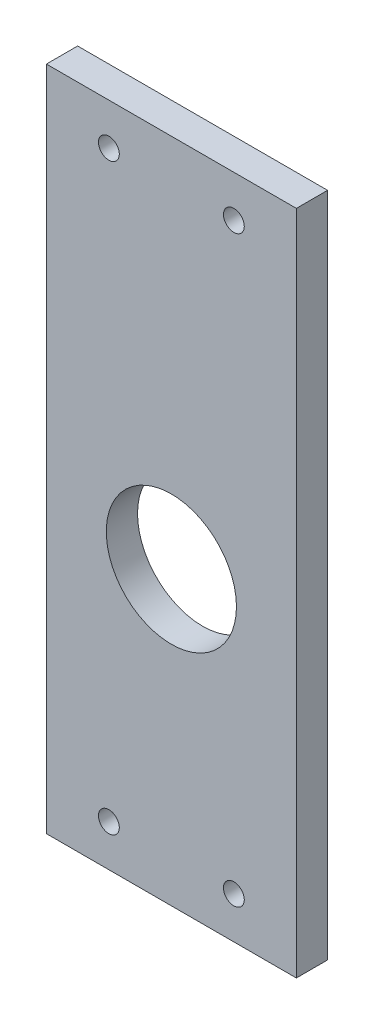
ISO-10303-21;
HEADER;
FILE_DESCRIPTION(('STEP AP214'),'2;1');
FILE_NAME('part.step','',(''),(''),'','','');
FILE_SCHEMA(('AUTOMOTIVE_DESIGN { 1 0 10303 214 1 1 1 1 }'));
ENDSEC;
DATA;
#1=APPLICATION_CONTEXT('core data for automotive mechanical design processes');
#2=APPLICATION_PROTOCOL_DEFINITION('international standard','automotive_design',2000,#1);
#3=PRODUCT_CONTEXT('',#1,'mechanical');
#4=PRODUCT('Part','Part','',(#3));
#5=PRODUCT_RELATED_PRODUCT_CATEGORY('part','',(#4));
#6=PRODUCT_DEFINITION_FORMATION('','',#4);
#7=PRODUCT_DEFINITION_CONTEXT('part definition',#1,'design');
#8=PRODUCT_DEFINITION('design','',#6,#7);
#9=PRODUCT_DEFINITION_SHAPE('','',#8);
#10=(LENGTH_UNIT() NAMED_UNIT(*) SI_UNIT(.MILLI.,.METRE.));
#11=(NAMED_UNIT(*) PLANE_ANGLE_UNIT() SI_UNIT($,.RADIAN.));
#12=(NAMED_UNIT(*) SI_UNIT($,.STERADIAN.) SOLID_ANGLE_UNIT());
#13=UNCERTAINTY_MEASURE_WITH_UNIT(LENGTH_MEASURE(1.E-05),#10,'distance_accuracy_value','');
#14=(GEOMETRIC_REPRESENTATION_CONTEXT(3) GLOBAL_UNCERTAINTY_ASSIGNED_CONTEXT((#13)) GLOBAL_UNIT_ASSIGNED_CONTEXT((#10,
#11,#12)) REPRESENTATION_CONTEXT('',''));
#15=CARTESIAN_POINT('',(0.,0.,0.));
#16=DIRECTION('',(0.,0.,1.));
#17=DIRECTION('',(1.,0.,0.));
#18=AXIS2_PLACEMENT_3D('',#15,#16,#17);
#19=CARTESIAN_POINT('',(0.,0.,9.525));
#20=DIRECTION('',(1.,0.,0.));
#21=DIRECTION('',(0.,0.,-1.));
#22=AXIS2_PLACEMENT_3D('',#19,#20,#21);
#23=PLANE('',#22);
#24=DIRECTION('',(0.,-1.,0.));
#25=VECTOR('',#24,1.);
#26=CARTESIAN_POINT('',(0.,0.,0.));
#27=LINE('',#26,#25);
#28=CARTESIAN_POINT('',(0.,203.2,0.));
#29=VERTEX_POINT('',#28);
#30=CARTESIAN_POINT('',(0.,0.,0.));
#31=VERTEX_POINT('',#30);
#32=EDGE_CURVE('E95',#29,#31,#27,.T.);
#33=ORIENTED_EDGE('',*,*,#32,.T.);
#34=DIRECTION('',(0.,0.,-1.));
#35=VECTOR('',#34,1.);
#36=CARTESIAN_POINT('',(0.,0.,9.525));
#37=LINE('',#36,#35);
#38=CARTESIAN_POINT('',(0.,0.,9.525));
#39=VERTEX_POINT('',#38);
#40=EDGE_CURVE('E11',#39,#31,#37,.T.);
#41=ORIENTED_EDGE('',*,*,#40,.F.);
#42=DIRECTION('',(0.,-1.,0.));
#43=VECTOR('',#42,1.);
#44=CARTESIAN_POINT('',(0.,0.,9.525));
#45=LINE('',#44,#43);
#46=CARTESIAN_POINT('',(0.,203.2,9.525));
#47=VERTEX_POINT('',#46);
#48=EDGE_CURVE('E83',#47,#39,#45,.T.);
#49=ORIENTED_EDGE('',*,*,#48,.F.);
#50=DIRECTION('',(0.,0.,-1.));
#51=VECTOR('',#50,1.);
#52=CARTESIAN_POINT('',(0.,203.2,9.525));
#53=LINE('',#52,#51);
#54=EDGE_CURVE('E91',#47,#29,#53,.T.);
#55=ORIENTED_EDGE('',*,*,#54,.T.);
#56=EDGE_LOOP('',(#33,#41,#49,#55));
#57=FACE_BOUND('',#56,.T.);
#58=ADVANCED_FACE('F32',(#57),#23,.F.);
#59=CARTESIAN_POINT('',(0.,0.,9.525));
#60=DIRECTION('',(0.,1.,0.));
#61=DIRECTION('',(0.,0.,1.));
#62=AXIS2_PLACEMENT_3D('',#59,#60,#61);
#63=PLANE('',#62);
#64=DIRECTION('',(1.,0.,0.));
#65=VECTOR('',#64,1.);
#66=CARTESIAN_POINT('',(0.,0.,0.));
#67=LINE('',#66,#65);
#68=CARTESIAN_POINT('',(76.2,0.,0.));
#69=VERTEX_POINT('',#68);
#70=EDGE_CURVE('E87',#31,#69,#67,.T.);
#71=ORIENTED_EDGE('',*,*,#70,.T.);
#72=DIRECTION('',(0.,0.,-1.));
#73=VECTOR('',#72,1.);
#74=CARTESIAN_POINT('',(76.2,0.,9.525));
#75=LINE('',#74,#73);
#76=CARTESIAN_POINT('',(76.2,0.,9.525));
#77=VERTEX_POINT('',#76);
#78=EDGE_CURVE('E40',#77,#69,#75,.T.);
#79=ORIENTED_EDGE('',*,*,#78,.F.);
#80=DIRECTION('',(1.,0.,0.));
#81=VECTOR('',#80,1.);
#82=CARTESIAN_POINT('',(0.,0.,9.525));
#83=LINE('',#82,#81);
#84=EDGE_CURVE('E78',#39,#77,#83,.T.);
#85=ORIENTED_EDGE('',*,*,#84,.F.);
#86=ORIENTED_EDGE('',*,*,#40,.T.);
#87=EDGE_LOOP('',(#71,#79,#85,#86));
#88=FACE_BOUND('',#87,.T.);
#89=ADVANCED_FACE('F86',(#88),#63,.F.);
#90=CARTESIAN_POINT('',(76.2,0.,9.525));
#91=DIRECTION('',(-1.,0.,0.));
#92=DIRECTION('',(0.,0.,1.));
#93=AXIS2_PLACEMENT_3D('',#90,#91,#92);
#94=PLANE('',#93);
#95=DIRECTION('',(0.,1.,0.));
#96=VECTOR('',#95,1.);
#97=CARTESIAN_POINT('',(76.2,0.,0.));
#98=LINE('',#97,#96);
#99=CARTESIAN_POINT('',(76.2,203.2,0.));
#100=VERTEX_POINT('',#99);
#101=EDGE_CURVE('E65',#69,#100,#98,.T.);
#102=ORIENTED_EDGE('',*,*,#101,.T.);
#103=DIRECTION('',(0.,0.,-1.));
#104=VECTOR('',#103,1.);
#105=CARTESIAN_POINT('',(76.2,203.2,9.525));
#106=LINE('',#105,#104);
#107=CARTESIAN_POINT('',(76.2,203.2,9.525));
#108=VERTEX_POINT('',#107);
#109=EDGE_CURVE('E88',#108,#100,#106,.T.);
#110=ORIENTED_EDGE('',*,*,#109,.F.);
#111=DIRECTION('',(0.,1.,0.));
#112=VECTOR('',#111,1.);
#113=CARTESIAN_POINT('',(76.2,0.,9.525));
#114=LINE('',#113,#112);
#115=EDGE_CURVE('E81',#77,#108,#114,.T.);
#116=ORIENTED_EDGE('',*,*,#115,.F.);
#117=ORIENTED_EDGE('',*,*,#78,.T.);
#118=EDGE_LOOP('',(#102,#110,#116,#117));
#119=FACE_BOUND('',#118,.T.);
#120=ADVANCED_FACE('F89',(#119),#94,.F.);
#121=CARTESIAN_POINT('',(0.,203.2,9.525));
#122=DIRECTION('',(0.,-1.,0.));
#123=DIRECTION('',(0.,0.,-1.));
#124=AXIS2_PLACEMENT_3D('',#121,#122,#123);
#125=PLANE('',#124);
#126=DIRECTION('',(-1.,0.,0.));
#127=VECTOR('',#126,1.);
#128=CARTESIAN_POINT('',(0.,203.2,0.));
#129=LINE('',#128,#127);
#130=EDGE_CURVE('E71',#100,#29,#129,.T.);
#131=ORIENTED_EDGE('',*,*,#130,.T.);
#132=ORIENTED_EDGE('',*,*,#54,.F.);
#133=DIRECTION('',(-1.,0.,0.));
#134=VECTOR('',#133,1.);
#135=CARTESIAN_POINT('',(0.,203.2,9.525));
#136=LINE('',#135,#134);
#137=EDGE_CURVE('E48',#108,#47,#136,.T.);
#138=ORIENTED_EDGE('',*,*,#137,.F.);
#139=ORIENTED_EDGE('',*,*,#109,.T.);
#140=EDGE_LOOP('',(#131,#132,#138,#139));
#141=FACE_BOUND('',#140,.T.);
#142=ADVANCED_FACE('F103',(#141),#125,.F.);
#143=CARTESIAN_POINT('',(0.,0.,9.525));
#144=DIRECTION('',(0.,0.,-1.));
#145=DIRECTION('',(-1.,0.,0.));
#146=AXIS2_PLACEMENT_3D('',#143,#144,#145);
#147=PLANE('',#146);
#148=CARTESIAN_POINT('',(57.15,190.5,9.525));
#149=DIRECTION('',(0.,0.,1.));
#150=DIRECTION('',(1.,0.,0.));
#151=AXIS2_PLACEMENT_3D('',#148,#149,#150);
#152=CIRCLE('',#151,3.175);
#153=CARTESIAN_POINT('',(60.325,190.5,9.525));
#154=VERTEX_POINT('',#153);
#155=EDGE_CURVE('E124',#154,#154,#152,.T.);
#156=ORIENTED_EDGE('',*,*,#155,.F.);
#157=EDGE_LOOP('',(#156));
#158=FACE_BOUND('',#157,.T.);
#159=CARTESIAN_POINT('',(19.05,12.7,9.525));
#160=DIRECTION('',(0.,0.,1.));
#161=DIRECTION('',(1.,0.,0.));
#162=AXIS2_PLACEMENT_3D('',#159,#160,#161);
#163=CIRCLE('',#162,3.175);
#164=CARTESIAN_POINT('',(22.225,12.7,9.525));
#165=VERTEX_POINT('',#164);
#166=EDGE_CURVE('E125',#165,#165,#163,.T.);
#167=ORIENTED_EDGE('',*,*,#166,.F.);
#168=EDGE_LOOP('',(#167));
#169=FACE_BOUND('',#168,.T.);
#170=CARTESIAN_POINT('',(57.15,12.7,9.525));
#171=DIRECTION('',(0.,0.,1.));
#172=DIRECTION('',(1.,0.,0.));
#173=AXIS2_PLACEMENT_3D('',#170,#171,#172);
#174=CIRCLE('',#173,3.175);
#175=CARTESIAN_POINT('',(60.325,12.7,9.525));
#176=VERTEX_POINT('',#175);
#177=EDGE_CURVE('E135',#176,#176,#174,.T.);
#178=ORIENTED_EDGE('',*,*,#177,.F.);
#179=EDGE_LOOP('',(#178));
#180=FACE_BOUND('',#179,.T.);
#181=CARTESIAN_POINT('',(19.05,190.5,9.525));
#182=DIRECTION('',(0.,0.,1.));
#183=DIRECTION('',(1.,0.,0.));
#184=AXIS2_PLACEMENT_3D('',#181,#182,#183);
#185=CIRCLE('',#184,3.175);
#186=CARTESIAN_POINT('',(22.225,190.5,9.525));
#187=VERTEX_POINT('',#186);
#188=EDGE_CURVE('E117',#187,#187,#185,.T.);
#189=ORIENTED_EDGE('',*,*,#188,.F.);
#190=EDGE_LOOP('',(#189));
#191=FACE_BOUND('',#190,.T.);
#192=CARTESIAN_POINT('',(38.1,88.9,9.525));
#193=DIRECTION('',(0.,0.,1.));
#194=DIRECTION('',(1.,0.,0.));
#195=AXIS2_PLACEMENT_3D('',#192,#193,#194);
#196=CIRCLE('',#195,19.84375);
#197=CARTESIAN_POINT('',(57.94375,88.9,9.525));
#198=VERTEX_POINT('',#197);
#199=EDGE_CURVE('E111',#198,#198,#196,.T.);
#200=ORIENTED_EDGE('',*,*,#199,.F.);
#201=EDGE_LOOP('',(#200));
#202=FACE_BOUND('',#201,.T.);
#203=ORIENTED_EDGE('',*,*,#48,.T.);
#204=ORIENTED_EDGE('',*,*,#84,.T.);
#205=ORIENTED_EDGE('',*,*,#115,.T.);
#206=ORIENTED_EDGE('',*,*,#137,.T.);
#207=EDGE_LOOP('',(#203,#204,#205,#206));
#208=FACE_BOUND('',#207,.T.);
#209=ADVANCED_FACE('F79',(#158,#169,#180,#191,#202,#208),#147,.F.);
#210=CARTESIAN_POINT('',(0.,0.,0.));
#211=DIRECTION('',(0.,0.,-1.));
#212=DIRECTION('',(-1.,0.,0.));
#213=AXIS2_PLACEMENT_3D('',#210,#211,#212);
#214=PLANE('',#213);
#215=CARTESIAN_POINT('',(57.15,190.5,0.));
#216=DIRECTION('',(0.,0.,-1.));
#217=DIRECTION('',(-1.,0.,0.));
#218=AXIS2_PLACEMENT_3D('',#215,#216,#217);
#219=CIRCLE('',#218,3.175);
#220=CARTESIAN_POINT('',(53.975,190.5,0.));
#221=VERTEX_POINT('',#220);
#222=EDGE_CURVE('E120',#221,#221,#219,.F.);
#223=ORIENTED_EDGE('',*,*,#222,.T.);
#224=EDGE_LOOP('',(#223));
#225=FACE_BOUND('',#224,.T.);
#226=CARTESIAN_POINT('',(19.05,12.7,0.));
#227=DIRECTION('',(0.,0.,-1.));
#228=DIRECTION('',(-1.,0.,0.));
#229=AXIS2_PLACEMENT_3D('',#226,#227,#228);
#230=CIRCLE('',#229,3.175);
#231=CARTESIAN_POINT('',(15.875,12.7,0.));
#232=VERTEX_POINT('',#231);
#233=EDGE_CURVE('E121',#232,#232,#230,.F.);
#234=ORIENTED_EDGE('',*,*,#233,.T.);
#235=EDGE_LOOP('',(#234));
#236=FACE_BOUND('',#235,.T.);
#237=CARTESIAN_POINT('',(57.15,12.7,0.));
#238=DIRECTION('',(0.,0.,-1.));
#239=DIRECTION('',(-1.,0.,0.));
#240=AXIS2_PLACEMENT_3D('',#237,#238,#239);
#241=CIRCLE('',#240,3.175);
#242=CARTESIAN_POINT('',(53.975,12.7,0.));
#243=VERTEX_POINT('',#242);
#244=EDGE_CURVE('E128',#243,#243,#241,.F.);
#245=ORIENTED_EDGE('',*,*,#244,.T.);
#246=EDGE_LOOP('',(#245));
#247=FACE_BOUND('',#246,.T.);
#248=CARTESIAN_POINT('',(19.05,190.5,0.));
#249=DIRECTION('',(0.,0.,-1.));
#250=DIRECTION('',(-1.,0.,0.));
#251=AXIS2_PLACEMENT_3D('',#248,#249,#250);
#252=CIRCLE('',#251,3.175);
#253=CARTESIAN_POINT('',(15.875,190.5,0.));
#254=VERTEX_POINT('',#253);
#255=EDGE_CURVE('E114',#254,#254,#252,.F.);
#256=ORIENTED_EDGE('',*,*,#255,.T.);
#257=EDGE_LOOP('',(#256));
#258=FACE_BOUND('',#257,.T.);
#259=CARTESIAN_POINT('',(38.1,88.9,0.));
#260=DIRECTION('',(0.,0.,-1.));
#261=DIRECTION('',(-1.,0.,0.));
#262=AXIS2_PLACEMENT_3D('',#259,#260,#261);
#263=CIRCLE('',#262,19.84375);
#264=CARTESIAN_POINT('',(18.25625,88.9,0.));
#265=VERTEX_POINT('',#264);
#266=EDGE_CURVE('E98',#265,#265,#263,.F.);
#267=ORIENTED_EDGE('',*,*,#266,.T.);
#268=EDGE_LOOP('',(#267));
#269=FACE_BOUND('',#268,.T.);
#270=ORIENTED_EDGE('',*,*,#32,.F.);
#271=ORIENTED_EDGE('',*,*,#130,.F.);
#272=ORIENTED_EDGE('',*,*,#101,.F.);
#273=ORIENTED_EDGE('',*,*,#70,.F.);
#274=EDGE_LOOP('',(#270,#271,#272,#273));
#275=FACE_BOUND('',#274,.T.);
#276=ADVANCED_FACE('F106',(#225,#236,#247,#258,#269,#275),#214,.T.);
#277=CARTESIAN_POINT('',(38.1,88.9,-56.1266007566822));
#278=DIRECTION('',(0.,0.,1.));
#279=DIRECTION('',(1.,0.,0.));
#280=AXIS2_PLACEMENT_3D('',#277,#278,#279);
#281=CYLINDRICAL_SURFACE('',#280,19.84375);
#282=ORIENTED_EDGE('',*,*,#199,.T.);
#283=EDGE_LOOP('',(#282));
#284=FACE_BOUND('',#283,.T.);
#285=ORIENTED_EDGE('',*,*,#266,.F.);
#286=EDGE_LOOP('',(#285));
#287=FACE_BOUND('',#286,.T.);
#288=ADVANCED_FACE('F150',(#284,#287),#281,.F.);
#289=CARTESIAN_POINT('',(19.05,190.5,-8.98025612106917));
#290=DIRECTION('',(0.,0.,1.));
#291=DIRECTION('',(1.,0.,0.));
#292=AXIS2_PLACEMENT_3D('',#289,#290,#291);
#293=CYLINDRICAL_SURFACE('',#292,3.175);
#294=ORIENTED_EDGE('',*,*,#188,.T.);
#295=EDGE_LOOP('',(#294));
#296=FACE_BOUND('',#295,.T.);
#297=ORIENTED_EDGE('',*,*,#255,.F.);
#298=EDGE_LOOP('',(#297));
#299=FACE_BOUND('',#298,.T.);
#300=ADVANCED_FACE('F153',(#296,#299),#293,.F.);
#301=CARTESIAN_POINT('',(57.15,12.7,-8.98025612106917));
#302=DIRECTION('',(0.,0.,1.));
#303=DIRECTION('',(1.,0.,0.));
#304=AXIS2_PLACEMENT_3D('',#301,#302,#303);
#305=CYLINDRICAL_SURFACE('',#304,3.175);
#306=ORIENTED_EDGE('',*,*,#177,.T.);
#307=EDGE_LOOP('',(#306));
#308=FACE_BOUND('',#307,.T.);
#309=ORIENTED_EDGE('',*,*,#244,.F.);
#310=EDGE_LOOP('',(#309));
#311=FACE_BOUND('',#310,.T.);
#312=ADVANCED_FACE('F139',(#308,#311),#305,.F.);
#313=CARTESIAN_POINT('',(19.05,12.7,-8.98025612106917));
#314=DIRECTION('',(0.,0.,1.));
#315=DIRECTION('',(1.,0.,0.));
#316=AXIS2_PLACEMENT_3D('',#313,#314,#315);
#317=CYLINDRICAL_SURFACE('',#316,3.175);
#318=ORIENTED_EDGE('',*,*,#166,.T.);
#319=EDGE_LOOP('',(#318));
#320=FACE_BOUND('',#319,.T.);
#321=ORIENTED_EDGE('',*,*,#233,.F.);
#322=EDGE_LOOP('',(#321));
#323=FACE_BOUND('',#322,.T.);
#324=ADVANCED_FACE('F206',(#320,#323),#317,.F.);
#325=CARTESIAN_POINT('',(57.15,190.5,-8.98025612106917));
#326=DIRECTION('',(0.,0.,1.));
#327=DIRECTION('',(1.,0.,0.));
#328=AXIS2_PLACEMENT_3D('',#325,#326,#327);
#329=CYLINDRICAL_SURFACE('',#328,3.175);
#330=ORIENTED_EDGE('',*,*,#155,.T.);
#331=EDGE_LOOP('',(#330));
#332=FACE_BOUND('',#331,.T.);
#333=ORIENTED_EDGE('',*,*,#222,.F.);
#334=EDGE_LOOP('',(#333));
#335=FACE_BOUND('',#334,.T.);
#336=ADVANCED_FACE('F215',(#332,#335),#329,.F.);
#337=CLOSED_SHELL('',(#58,#89,#120,#142,#209,#276,#288,#300,#312,#324,#336));
#338=MANIFOLD_SOLID_BREP('B2',#337);
#339=ADVANCED_BREP_SHAPE_REPRESENTATION('',(#18,#338),#14);
#340=SHAPE_DEFINITION_REPRESENTATION(#9,#339);
ENDSEC;
END-ISO-10303-21;
